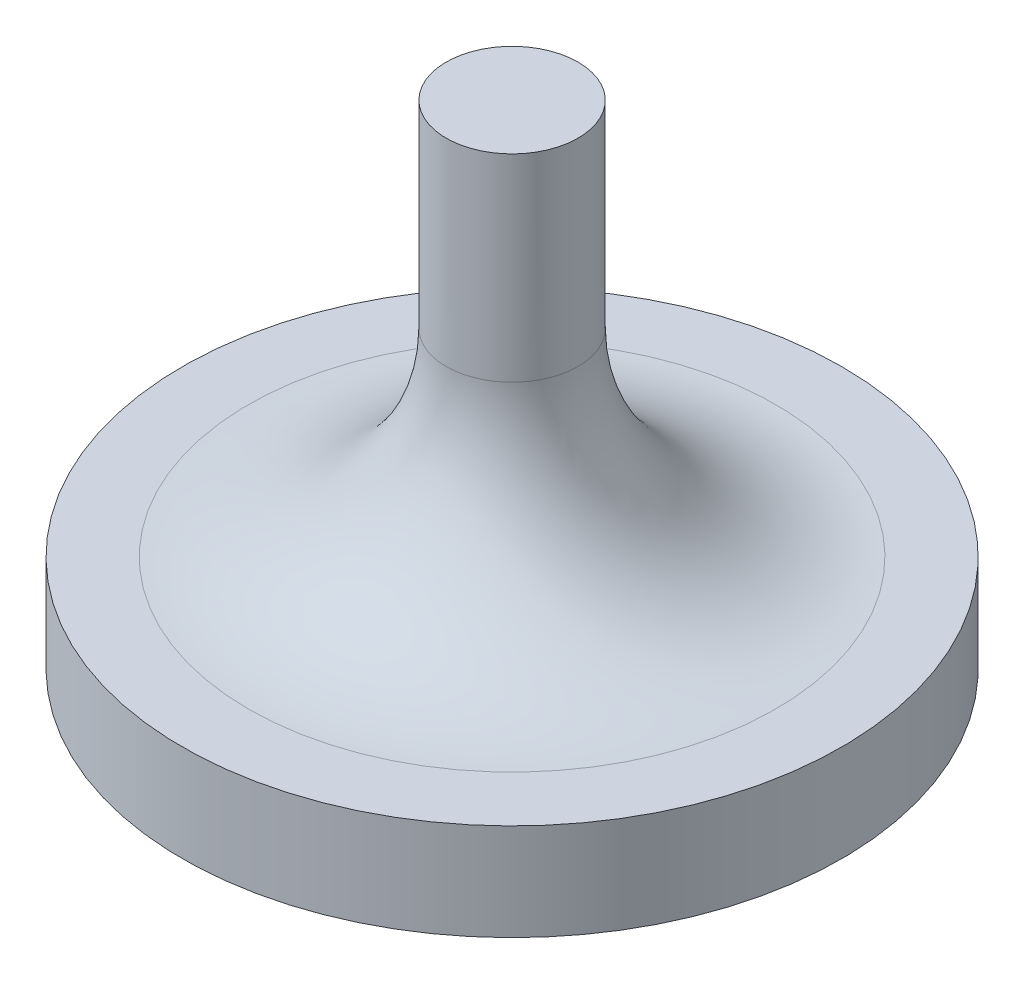
ISO-10303-21;
HEADER;
FILE_DESCRIPTION(('STEP AP214'),'2;1');
FILE_NAME('part.step','',(''),(''),'','','');
FILE_SCHEMA(('AUTOMOTIVE_DESIGN { 1 0 10303 214 1 1 1 1 }'));
ENDSEC;
DATA;
#1=APPLICATION_CONTEXT('core data for automotive mechanical design processes');
#2=APPLICATION_PROTOCOL_DEFINITION('international standard','automotive_design',2000,#1);
#3=PRODUCT_CONTEXT('',#1,'mechanical');
#4=PRODUCT('Part','Part','',(#3));
#5=PRODUCT_RELATED_PRODUCT_CATEGORY('part','',(#4));
#6=PRODUCT_DEFINITION_FORMATION('','',#4);
#7=PRODUCT_DEFINITION_CONTEXT('part definition',#1,'design');
#8=PRODUCT_DEFINITION('design','',#6,#7);
#9=PRODUCT_DEFINITION_SHAPE('','',#8);
#10=(LENGTH_UNIT() NAMED_UNIT(*) SI_UNIT(.MILLI.,.METRE.));
#11=(NAMED_UNIT(*) PLANE_ANGLE_UNIT() SI_UNIT($,.RADIAN.));
#12=(NAMED_UNIT(*) SI_UNIT($,.STERADIAN.) SOLID_ANGLE_UNIT());
#13=UNCERTAINTY_MEASURE_WITH_UNIT(LENGTH_MEASURE(1.E-05),#10,'distance_accuracy_value','');
#14=(GEOMETRIC_REPRESENTATION_CONTEXT(3) GLOBAL_UNCERTAINTY_ASSIGNED_CONTEXT((#13)) GLOBAL_UNIT_ASSIGNED_CONTEXT((#10,
#11,#12)) REPRESENTATION_CONTEXT('',''));
#15=CARTESIAN_POINT('',(0.,0.,0.));
#16=DIRECTION('',(0.,0.,1.));
#17=DIRECTION('',(1.,0.,0.));
#18=AXIS2_PLACEMENT_3D('',#15,#16,#17);
#19=CARTESIAN_POINT('',(0.,0.,0.));
#20=DIRECTION('',(0.,1.,0.));
#21=DIRECTION('',(0.,0.,1.));
#22=AXIS2_PLACEMENT_3D('',#19,#20,#21);
#23=CONICAL_SURFACE('',#22,0.,0.523598775598293);
#24=CARTESIAN_POINT('',(0.,8.66025403784452,0.));
#25=DIRECTION('',(0.,-1.,0.));
#26=DIRECTION('',(0.,0.,-1.));
#27=AXIS2_PLACEMENT_3D('',#24,#25,#26);
#28=CIRCLE('',#27,5.00000000000001);
#29=CARTESIAN_POINT('',(0.,8.66025403784452,-5.00000000000001));
#30=VERTEX_POINT('',#29);
#31=EDGE_CURVE('E76',#30,#30,#28,.T.);
#32=ORIENTED_EDGE('',*,*,#31,.T.);
#33=EDGE_LOOP('',(#32));
#34=FACE_BOUND('',#33,.T.);
#35=CARTESIAN_POINT('',(0.,0.,0.));
#36=VERTEX_POINT('',#35);
#37=VERTEX_LOOP('',#36);
#38=FACE_BOUND('',#37,.T.);
#39=ADVANCED_FACE('F37',(#34,#38),#23,.T.);
#40=CARTESIAN_POINT('',(0.,12.6602540378445,-25.));
#41=DIRECTION('',(0.,-1.,0.));
#42=DIRECTION('',(0.,0.,-1.));
#43=AXIS2_PLACEMENT_3D('',#40,#41,#42);
#44=PLANE('',#43);
#45=CARTESIAN_POINT('',(0.,12.6602540378445,0.));
#46=DIRECTION('',(0.,-1.,0.));
#47=DIRECTION('',(0.,0.,-1.));
#48=AXIS2_PLACEMENT_3D('',#45,#46,#47);
#49=CIRCLE('',#48,24.5959179422654);
#50=CARTESIAN_POINT('',(0.,12.6602540378445,-24.5959179422654));
#51=VERTEX_POINT('',#50);
#52=EDGE_CURVE('E74',#51,#51,#49,.F.);
#53=ORIENTED_EDGE('',*,*,#52,.T.);
#54=EDGE_LOOP('',(#53));
#55=FACE_BOUND('',#54,.T.);
#56=CARTESIAN_POINT('',(0.,12.6602540378445,0.));
#57=DIRECTION('',(0.,-1.,0.));
#58=DIRECTION('',(0.,0.,-1.));
#59=AXIS2_PLACEMENT_3D('',#56,#57,#58);
#60=CIRCLE('',#59,25.);
#61=CARTESIAN_POINT('',(0.,12.6602540378445,-25.));
#62=VERTEX_POINT('',#61);
#63=EDGE_CURVE('E77',#62,#62,#60,.T.);
#64=ORIENTED_EDGE('',*,*,#63,.T.);
#65=EDGE_LOOP('',(#64));
#66=FACE_BOUND('',#65,.T.);
#67=ADVANCED_FACE('F48',(#55,#66),#44,.T.);
#68=CARTESIAN_POINT('',(0.,0.,0.));
#69=DIRECTION('',(0.,-1.,0.));
#70=DIRECTION('',(0.,0.,-1.));
#71=AXIS2_PLACEMENT_3D('',#68,#69,#70);
#72=CYLINDRICAL_SURFACE('',#71,25.);
#73=CARTESIAN_POINT('',(0.,20.,0.));
#74=DIRECTION('',(0.,-1.,0.));
#75=DIRECTION('',(0.,0.,-1.));
#76=AXIS2_PLACEMENT_3D('',#73,#74,#75);
#77=CIRCLE('',#76,25.);
#78=CARTESIAN_POINT('',(0.,20.,-25.));
#79=VERTEX_POINT('',#78);
#80=EDGE_CURVE('E81',#79,#79,#77,.T.);
#81=ORIENTED_EDGE('',*,*,#80,.T.);
#82=EDGE_LOOP('',(#81));
#83=FACE_BOUND('',#82,.T.);
#84=ORIENTED_EDGE('',*,*,#63,.F.);
#85=EDGE_LOOP('',(#84));
#86=FACE_BOUND('',#85,.T.);
#87=ADVANCED_FACE('F54',(#83,#86),#72,.T.);
#88=CARTESIAN_POINT('',(0.,20.,-5.));
#89=DIRECTION('',(0.,1.,0.));
#90=DIRECTION('',(0.,0.,1.));
#91=AXIS2_PLACEMENT_3D('',#88,#89,#90);
#92=PLANE('',#91);
#93=CARTESIAN_POINT('',(0.,20.,0.));
#94=DIRECTION('',(0.,1.,0.));
#95=DIRECTION('',(0.,0.,1.));
#96=AXIS2_PLACEMENT_3D('',#93,#94,#95);
#97=CIRCLE('',#96,20.);
#98=CARTESIAN_POINT('',(0.,20.,20.));
#99=VERTEX_POINT('',#98);
#100=EDGE_CURVE('E44',#99,#99,#97,.F.);
#101=ORIENTED_EDGE('',*,*,#100,.T.);
#102=EDGE_LOOP('',(#101));
#103=FACE_BOUND('',#102,.T.);
#104=ORIENTED_EDGE('',*,*,#80,.F.);
#105=EDGE_LOOP('',(#104));
#106=FACE_BOUND('',#105,.T.);
#107=ADVANCED_FACE('F87',(#103,#106),#92,.T.);
#108=CARTESIAN_POINT('',(0.,0.,0.));
#109=DIRECTION('',(0.,-1.,0.));
#110=DIRECTION('',(0.,0.,-1.));
#111=AXIS2_PLACEMENT_3D('',#108,#109,#110);
#112=CYLINDRICAL_SURFACE('',#111,5.);
#113=CARTESIAN_POINT('',(0.,35.,0.));
#114=DIRECTION('',(0.,1.,0.));
#115=DIRECTION('',(0.,0.,1.));
#116=AXIS2_PLACEMENT_3D('',#113,#114,#115);
#117=CIRCLE('',#116,5.);
#118=CARTESIAN_POINT('',(0.,35.,5.));
#119=VERTEX_POINT('',#118);
#120=EDGE_CURVE('E11',#119,#119,#117,.T.);
#121=ORIENTED_EDGE('',*,*,#120,.T.);
#122=EDGE_LOOP('',(#121));
#123=FACE_BOUND('',#122,.T.);
#124=CARTESIAN_POINT('',(0.,50.,0.));
#125=DIRECTION('',(0.,-1.,0.));
#126=DIRECTION('',(0.,0.,-1.));
#127=AXIS2_PLACEMENT_3D('',#124,#125,#126);
#128=CIRCLE('',#127,5.);
#129=CARTESIAN_POINT('',(0.,50.,-5.));
#130=VERTEX_POINT('',#129);
#131=EDGE_CURVE('E95',#130,#130,#128,.T.);
#132=ORIENTED_EDGE('',*,*,#131,.T.);
#133=EDGE_LOOP('',(#132));
#134=FACE_BOUND('',#133,.T.);
#135=ADVANCED_FACE('F68',(#123,#134),#112,.T.);
#136=CARTESIAN_POINT('',(0.,50.,0.));
#137=DIRECTION('',(0.,1.,0.));
#138=DIRECTION('',(0.,0.,1.));
#139=AXIS2_PLACEMENT_3D('',#136,#137,#138);
#140=PLANE('',#139);
#141=ORIENTED_EDGE('',*,*,#131,.F.);
#142=EDGE_LOOP('',(#141));
#143=FACE_BOUND('',#142,.T.);
#144=ADVANCED_FACE('F61',(#143),#140,.T.);
#145=CARTESIAN_POINT('',(0.,-37.3397459621555,0.));
#146=DIRECTION('',(0.,-1.,0.));
#147=DIRECTION('',(0.,0.,-1.));
#148=AXIS2_PLACEMENT_3D('',#145,#146,#147);
#149=DEGENERATE_TOROIDAL_SURFACE('',#148,24.5959179422654,50.,.T.);
#150=ORIENTED_EDGE('',*,*,#52,.F.);
#151=EDGE_LOOP('',(#150));
#152=FACE_BOUND('',#151,.T.);
#153=ORIENTED_EDGE('',*,*,#31,.F.);
#154=EDGE_LOOP('',(#153));
#155=FACE_BOUND('',#154,.T.);
#156=ADVANCED_FACE('F59',(#152,#155),#149,.F.);
#157=CARTESIAN_POINT('',(0.,35.,0.));
#158=DIRECTION('',(0.,1.,0.));
#159=DIRECTION('',(0.,0.,1.));
#160=AXIS2_PLACEMENT_3D('',#157,#158,#159);
#161=TOROIDAL_SURFACE('',#160,20.,15.);
#162=ORIENTED_EDGE('',*,*,#120,.F.);
#163=EDGE_LOOP('',(#162));
#164=FACE_BOUND('',#163,.T.);
#165=ORIENTED_EDGE('',*,*,#100,.F.);
#166=EDGE_LOOP('',(#165));
#167=FACE_BOUND('',#166,.T.);
#168=ADVANCED_FACE('F39',(#164,#167),#161,.F.);
#169=CLOSED_SHELL('',(#39,#67,#87,#107,#135,#144,#156,#168));
#170=MANIFOLD_SOLID_BREP('B2',#169);
#171=ADVANCED_BREP_SHAPE_REPRESENTATION('',(#18,#170),#14);
#172=SHAPE_DEFINITION_REPRESENTATION(#9,#171);
ENDSEC;
END-ISO-10303-21;
